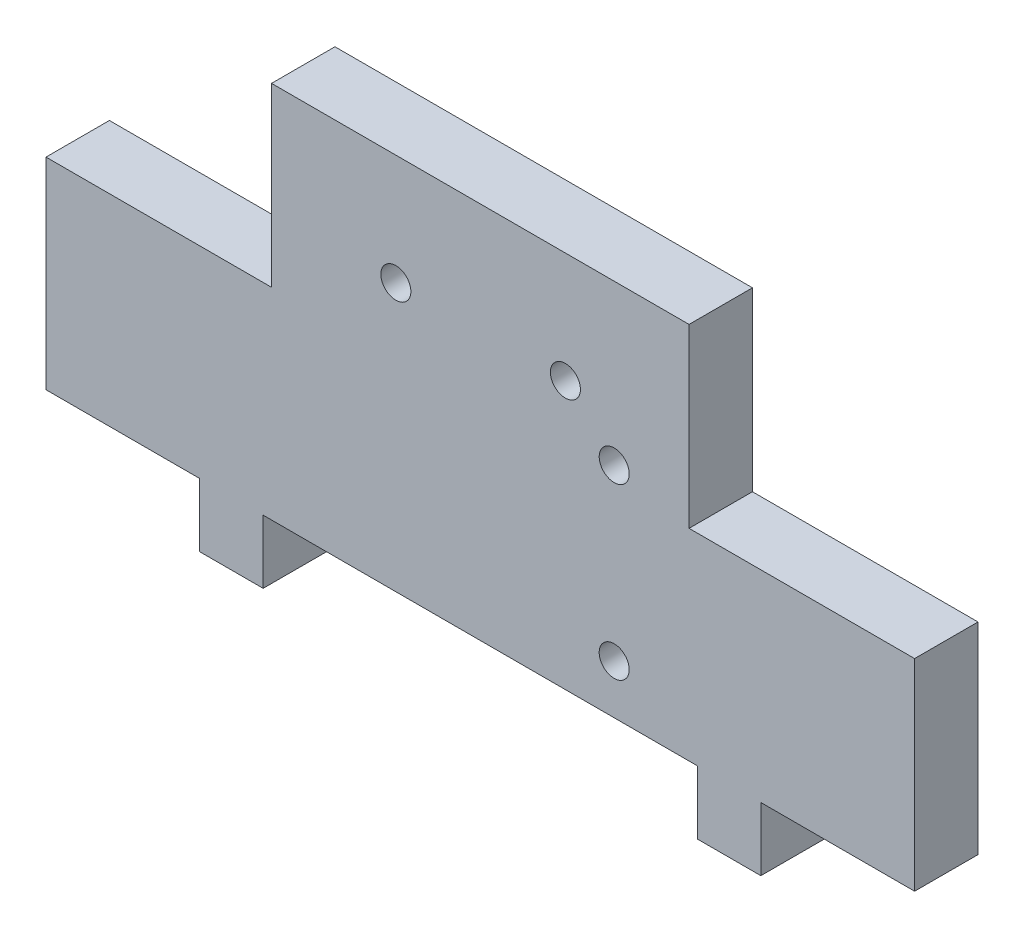
ISO-10303-21;
HEADER;
FILE_DESCRIPTION(('STEP AP214'),'2;1');
FILE_NAME('part.step','',(''),(''),'','','');
FILE_SCHEMA(('AUTOMOTIVE_DESIGN { 1 0 10303 214 1 1 1 1 }'));
ENDSEC;
DATA;
#1=APPLICATION_CONTEXT('core data for automotive mechanical design processes');
#2=APPLICATION_PROTOCOL_DEFINITION('international standard','automotive_design',2000,#1);
#3=PRODUCT_CONTEXT('',#1,'mechanical');
#4=PRODUCT('Part','Part','',(#3));
#5=PRODUCT_RELATED_PRODUCT_CATEGORY('part','',(#4));
#6=PRODUCT_DEFINITION_FORMATION('','',#4);
#7=PRODUCT_DEFINITION_CONTEXT('part definition',#1,'design');
#8=PRODUCT_DEFINITION('design','',#6,#7);
#9=PRODUCT_DEFINITION_SHAPE('','',#8);
#10=(LENGTH_UNIT() NAMED_UNIT(*) SI_UNIT(.MILLI.,.METRE.));
#11=(NAMED_UNIT(*) PLANE_ANGLE_UNIT() SI_UNIT($,.RADIAN.));
#12=(NAMED_UNIT(*) SI_UNIT($,.STERADIAN.) SOLID_ANGLE_UNIT());
#13=UNCERTAINTY_MEASURE_WITH_UNIT(LENGTH_MEASURE(1.E-05),#10,'distance_accuracy_value','');
#14=(GEOMETRIC_REPRESENTATION_CONTEXT(3) GLOBAL_UNCERTAINTY_ASSIGNED_CONTEXT((#13)) GLOBAL_UNIT_ASSIGNED_CONTEXT((#10,
#11,#12)) REPRESENTATION_CONTEXT('',''));
#15=CARTESIAN_POINT('',(0.,0.,0.));
#16=DIRECTION('',(0.,0.,1.));
#17=DIRECTION('',(1.,0.,0.));
#18=AXIS2_PLACEMENT_3D('',#15,#16,#17);
#19=CARTESIAN_POINT('',(0.,-9.525,4.5593));
#20=DIRECTION('',(0.,1.,0.));
#21=DIRECTION('',(-1.,0.,0.));
#22=AXIS2_PLACEMENT_3D('',#19,#20,#21);
#23=PLANE('',#22);
#24=DIRECTION('',(1.,0.,0.));
#25=VECTOR('',#24,1.);
#26=CARTESIAN_POINT('',(0.,-9.525,0.));
#27=LINE('',#26,#25);
#28=CARTESIAN_POINT('',(-20.173949999999,-9.52499999999995,-6.41847686111419E-13));
#29=VERTEX_POINT('',#28);
#30=CARTESIAN_POINT('',(-15.614649999999,-9.52499999999995,-5.95010152260045E-13));
#31=VERTEX_POINT('',#30);
#32=EDGE_CURVE('E229',#29,#31,#27,.T.);
#33=ORIENTED_EDGE('',*,*,#32,.T.);
#34=DIRECTION('',(0.,0.,-1.));
#35=VECTOR('',#34,1.);
#36=CARTESIAN_POINT('',(-15.6146499999992,-9.52499999999995,14.0893799999996));
#37=LINE('',#36,#35);
#38=CARTESIAN_POINT('',(-15.6146499999991,-9.52499999999995,4.5592999999994));
#39=VERTEX_POINT('',#38);
#40=EDGE_CURVE('E266',#39,#31,#37,.T.);
#41=ORIENTED_EDGE('',*,*,#40,.F.);
#42=DIRECTION('',(1.,0.,0.));
#43=VECTOR('',#42,1.);
#44=CARTESIAN_POINT('',(0.,-9.525,4.5593));
#45=LINE('',#44,#43);
#46=CARTESIAN_POINT('',(-20.1739499999991,-9.52499999999995,4.55929999999936));
#47=VERTEX_POINT('',#46);
#48=EDGE_CURVE('E207',#47,#39,#45,.T.);
#49=ORIENTED_EDGE('',*,*,#48,.F.);
#50=DIRECTION('',(0.,0.,-1.));
#51=VECTOR('',#50,1.);
#52=CARTESIAN_POINT('',(-20.1739499999992,-9.52499999999995,14.0893799999996));
#53=LINE('',#52,#51);
#54=EDGE_CURVE('E170',#47,#29,#53,.T.);
#55=ORIENTED_EDGE('',*,*,#54,.T.);
#56=EDGE_LOOP('',(#33,#41,#49,#55));
#57=FACE_BOUND('',#56,.T.);
#58=ADVANCED_FACE('F35',(#57),#23,.F.);
#59=CARTESIAN_POINT('',(15.614650000001,-9.52499999999995,-2.51534904016637E-13));
#60=VERTEX_POINT('',#59);
#61=CARTESIAN_POINT('',(20.173950000001,-9.52499999999999,0.));
#62=VERTEX_POINT('',#61);
#63=EDGE_CURVE('E226',#60,#62,#27,.T.);
#64=ORIENTED_EDGE('',*,*,#63,.T.);
#65=DIRECTION('',(0.,0.,-1.));
#66=VECTOR('',#65,1.);
#67=CARTESIAN_POINT('',(20.1739500000008,-9.52499999999995,14.08938));
#68=LINE('',#67,#66);
#69=CARTESIAN_POINT('',(20.1739500000009,-9.52499999999995,4.5592999999998));
#70=VERTEX_POINT('',#69);
#71=EDGE_CURVE('E260',#70,#62,#68,.T.);
#72=ORIENTED_EDGE('',*,*,#71,.F.);
#73=CARTESIAN_POINT('',(15.6146500000009,-9.52499999999995,4.55929999999975));
#74=VERTEX_POINT('',#73);
#75=EDGE_CURVE('E176',#74,#70,#45,.T.);
#76=ORIENTED_EDGE('',*,*,#75,.F.);
#77=DIRECTION('',(0.,0.,-1.));
#78=VECTOR('',#77,1.);
#79=CARTESIAN_POINT('',(15.6146500000008,-9.52499999999995,14.08938));
#80=LINE('',#79,#78);
#81=EDGE_CURVE('E263',#74,#60,#80,.T.);
#82=ORIENTED_EDGE('',*,*,#81,.T.);
#83=EDGE_LOOP('',(#64,#72,#76,#82));
#84=FACE_BOUND('',#83,.T.);
#85=ADVANCED_FACE('F284',(#84),#23,.F.);
#86=CARTESIAN_POINT('',(15.0109201230228,0.,4.5593));
#87=DIRECTION('',(-1.,0.,0.));
#88=DIRECTION('',(0.,-1.,0.));
#89=AXIS2_PLACEMENT_3D('',#86,#87,#88);
#90=PLANE('',#89);
#91=DIRECTION('',(0.,1.,0.));
#92=VECTOR('',#91,1.);
#93=CARTESIAN_POINT('',(15.0109201230228,0.,0.));
#94=LINE('',#93,#92);
#95=CARTESIAN_POINT('',(15.0109201230228,9.525,0.));
#96=VERTEX_POINT('',#95);
#97=CARTESIAN_POINT('',(15.0109201230228,22.225,0.));
#98=VERTEX_POINT('',#97);
#99=EDGE_CURVE('E160',#96,#98,#94,.T.);
#100=ORIENTED_EDGE('',*,*,#99,.T.);
#101=DIRECTION('',(0.,0.,-1.));
#102=VECTOR('',#101,1.);
#103=CARTESIAN_POINT('',(15.0109201230228,22.225,4.5593));
#104=LINE('',#103,#102);
#105=CARTESIAN_POINT('',(15.0109201230228,22.225,4.5593));
#106=VERTEX_POINT('',#105);
#107=EDGE_CURVE('E245',#106,#98,#104,.T.);
#108=ORIENTED_EDGE('',*,*,#107,.F.);
#109=DIRECTION('',(0.,1.,0.));
#110=VECTOR('',#109,1.);
#111=CARTESIAN_POINT('',(15.0109201230228,0.,4.5593));
#112=LINE('',#111,#110);
#113=CARTESIAN_POINT('',(15.0109201230228,9.525,4.5593));
#114=VERTEX_POINT('',#113);
#115=EDGE_CURVE('E192',#114,#106,#112,.T.);
#116=ORIENTED_EDGE('',*,*,#115,.F.);
#117=DIRECTION('',(0.,0.,-1.));
#118=VECTOR('',#117,1.);
#119=CARTESIAN_POINT('',(15.0109201230228,9.525,4.5593));
#120=LINE('',#119,#118);
#121=EDGE_CURVE('E212',#114,#96,#120,.T.);
#122=ORIENTED_EDGE('',*,*,#121,.T.);
#123=EDGE_LOOP('',(#100,#108,#116,#122));
#124=FACE_BOUND('',#123,.T.);
#125=ADVANCED_FACE('F37',(#124),#90,.F.);
#126=CARTESIAN_POINT('',(0.,22.225,4.5593));
#127=DIRECTION('',(0.,-1.,0.));
#128=DIRECTION('',(1.,0.,0.));
#129=AXIS2_PLACEMENT_3D('',#126,#127,#128);
#130=PLANE('',#129);
#131=DIRECTION('',(-1.,0.,0.));
#132=VECTOR('',#131,1.);
#133=CARTESIAN_POINT('',(0.,22.225,0.));
#134=LINE('',#133,#132);
#135=CARTESIAN_POINT('',(-15.0109201230229,22.225,0.));
#136=VERTEX_POINT('',#135);
#137=EDGE_CURVE('E215',#98,#136,#134,.T.);
#138=ORIENTED_EDGE('',*,*,#137,.T.);
#139=DIRECTION('',(0.,0.,-1.));
#140=VECTOR('',#139,1.);
#141=CARTESIAN_POINT('',(-15.0109201230229,22.225,4.5593));
#142=LINE('',#141,#140);
#143=CARTESIAN_POINT('',(-15.0109201230229,22.225,4.5593));
#144=VERTEX_POINT('',#143);
#145=EDGE_CURVE('E243',#144,#136,#142,.T.);
#146=ORIENTED_EDGE('',*,*,#145,.F.);
#147=DIRECTION('',(-1.,0.,0.));
#148=VECTOR('',#147,1.);
#149=CARTESIAN_POINT('',(0.,22.225,4.5593));
#150=LINE('',#149,#148);
#151=EDGE_CURVE('E195',#106,#144,#150,.T.);
#152=ORIENTED_EDGE('',*,*,#151,.F.);
#153=ORIENTED_EDGE('',*,*,#107,.T.);
#154=EDGE_LOOP('',(#138,#146,#152,#153));
#155=FACE_BOUND('',#154,.T.);
#156=ADVANCED_FACE('F300',(#155),#130,.F.);
#157=CARTESIAN_POINT('',(-15.0109201230229,0.,4.5593));
#158=DIRECTION('',(-1.,0.,0.));
#159=DIRECTION('',(0.,0.,1.));
#160=AXIS2_PLACEMENT_3D('',#157,#158,#159);
#161=PLANE('',#160);
#162=DIRECTION('',(0.,1.,0.));
#163=VECTOR('',#162,1.);
#164=CARTESIAN_POINT('',(-15.0109201230229,0.,0.));
#165=LINE('',#164,#163);
#166=CARTESIAN_POINT('',(-15.0109201230229,9.52500000000001,0.));
#167=VERTEX_POINT('',#166);
#168=EDGE_CURVE('E218',#167,#136,#165,.T.);
#169=ORIENTED_EDGE('',*,*,#168,.F.);
#170=DIRECTION('',(0.,0.,-1.));
#171=VECTOR('',#170,1.);
#172=CARTESIAN_POINT('',(-15.0109201230229,9.52500000000001,4.5593));
#173=LINE('',#172,#171);
#174=CARTESIAN_POINT('',(-15.0109201230229,9.52500000000001,4.5593));
#175=VERTEX_POINT('',#174);
#176=EDGE_CURVE('E241',#175,#167,#173,.T.);
#177=ORIENTED_EDGE('',*,*,#176,.F.);
#178=DIRECTION('',(0.,1.,0.));
#179=VECTOR('',#178,1.);
#180=CARTESIAN_POINT('',(-15.0109201230229,0.,4.5593));
#181=LINE('',#180,#179);
#182=EDGE_CURVE('E198',#175,#144,#181,.T.);
#183=ORIENTED_EDGE('',*,*,#182,.T.);
#184=ORIENTED_EDGE('',*,*,#145,.T.);
#185=EDGE_LOOP('',(#169,#177,#183,#184));
#186=FACE_BOUND('',#185,.T.);
#187=ADVANCED_FACE('F385',(#186),#161,.T.);
#188=CARTESIAN_POINT('',(0.,9.52500000000001,4.5593));
#189=DIRECTION('',(0.,1.,0.));
#190=DIRECTION('',(0.,0.,1.));
#191=AXIS2_PLACEMENT_3D('',#188,#189,#190);
#192=PLANE('',#191);
#193=DIRECTION('',(1.,0.,0.));
#194=VECTOR('',#193,1.);
#195=CARTESIAN_POINT('',(0.,9.52500000000001,0.));
#196=LINE('',#195,#194);
#197=CARTESIAN_POINT('',(-31.2293,9.52500000000001,0.));
#198=VERTEX_POINT('',#197);
#199=EDGE_CURVE('E221',#198,#167,#196,.T.);
#200=ORIENTED_EDGE('',*,*,#199,.F.);
#201=DIRECTION('',(0.,0.,-1.));
#202=VECTOR('',#201,1.);
#203=CARTESIAN_POINT('',(-31.2293,9.52500000000001,4.5593));
#204=LINE('',#203,#202);
#205=CARTESIAN_POINT('',(-31.2293,9.52500000000001,4.5593));
#206=VERTEX_POINT('',#205);
#207=EDGE_CURVE('E238',#206,#198,#204,.T.);
#208=ORIENTED_EDGE('',*,*,#207,.F.);
#209=DIRECTION('',(1.,0.,0.));
#210=VECTOR('',#209,1.);
#211=CARTESIAN_POINT('',(0.,9.52500000000001,4.5593));
#212=LINE('',#211,#210);
#213=EDGE_CURVE('E201',#206,#175,#212,.T.);
#214=ORIENTED_EDGE('',*,*,#213,.T.);
#215=ORIENTED_EDGE('',*,*,#176,.T.);
#216=EDGE_LOOP('',(#200,#208,#214,#215));
#217=FACE_BOUND('',#216,.T.);
#218=ADVANCED_FACE('F309',(#217),#192,.T.);
#219=CARTESIAN_POINT('',(-31.2293,0.,4.5593));
#220=DIRECTION('',(-1.,0.,0.));
#221=DIRECTION('',(0.,0.,1.));
#222=AXIS2_PLACEMENT_3D('',#219,#220,#221);
#223=PLANE('',#222);
#224=DIRECTION('',(0.,0.,1.));
#225=VECTOR('',#224,1.);
#226=CARTESIAN_POINT('',(-31.2293,-4.96570000000002,14.08938));
#227=LINE('',#226,#225);
#228=CARTESIAN_POINT('',(-31.2293,-4.96570000000002,0.));
#229=VERTEX_POINT('',#228);
#230=CARTESIAN_POINT('',(-31.2293,-4.96570000000002,4.5593));
#231=VERTEX_POINT('',#230);
#232=EDGE_CURVE('E187',#229,#231,#227,.T.);
#233=ORIENTED_EDGE('',*,*,#232,.T.);
#234=DIRECTION('',(0.,1.,0.));
#235=VECTOR('',#234,1.);
#236=CARTESIAN_POINT('',(-31.2293,0.,4.5593));
#237=LINE('',#236,#235);
#238=EDGE_CURVE('E204',#231,#206,#237,.T.);
#239=ORIENTED_EDGE('',*,*,#238,.T.);
#240=ORIENTED_EDGE('',*,*,#207,.T.);
#241=DIRECTION('',(0.,1.,0.));
#242=VECTOR('',#241,1.);
#243=CARTESIAN_POINT('',(-31.2293,0.,0.));
#244=LINE('',#243,#242);
#245=EDGE_CURVE('E224',#229,#198,#244,.T.);
#246=ORIENTED_EDGE('',*,*,#245,.F.);
#247=EDGE_LOOP('',(#233,#239,#240,#246));
#248=FACE_BOUND('',#247,.T.);
#249=ADVANCED_FACE('F313',(#248),#223,.T.);
#250=CARTESIAN_POINT('',(31.2293,0.,4.5593));
#251=DIRECTION('',(-1.,0.,0.));
#252=DIRECTION('',(0.,-1.,0.));
#253=AXIS2_PLACEMENT_3D('',#250,#251,#252);
#254=PLANE('',#253);
#255=DIRECTION('',(0.,1.,0.));
#256=VECTOR('',#255,1.);
#257=CARTESIAN_POINT('',(31.2293,0.,4.5593));
#258=LINE('',#257,#256);
#259=CARTESIAN_POINT('',(31.2293000000009,-4.96570000000003,4.5593));
#260=VERTEX_POINT('',#259);
#261=CARTESIAN_POINT('',(31.2293,9.52500000000001,4.5593));
#262=VERTEX_POINT('',#261);
#263=EDGE_CURVE('E208',#260,#262,#258,.T.);
#264=ORIENTED_EDGE('',*,*,#263,.F.);
#265=DIRECTION('',(0.,0.,-1.));
#266=VECTOR('',#265,1.);
#267=CARTESIAN_POINT('',(31.2293000000008,-4.96570000000003,14.0893799999999));
#268=LINE('',#267,#266);
#269=CARTESIAN_POINT('',(31.229300000001,-4.96570000000003,0.));
#270=VERTEX_POINT('',#269);
#271=EDGE_CURVE('E156',#260,#270,#268,.T.);
#272=ORIENTED_EDGE('',*,*,#271,.T.);
#273=DIRECTION('',(0.,1.,0.));
#274=VECTOR('',#273,1.);
#275=CARTESIAN_POINT('',(31.2293,0.,0.));
#276=LINE('',#275,#274);
#277=CARTESIAN_POINT('',(31.2293,9.52500000000001,0.));
#278=VERTEX_POINT('',#277);
#279=EDGE_CURVE('E230',#270,#278,#276,.T.);
#280=ORIENTED_EDGE('',*,*,#279,.T.);
#281=DIRECTION('',(0.,0.,-1.));
#282=VECTOR('',#281,1.);
#283=CARTESIAN_POINT('',(31.2293,9.52500000000001,4.5593));
#284=LINE('',#283,#282);
#285=EDGE_CURVE('E235',#262,#278,#284,.T.);
#286=ORIENTED_EDGE('',*,*,#285,.F.);
#287=EDGE_LOOP('',(#264,#272,#280,#286));
#288=FACE_BOUND('',#287,.T.);
#289=ADVANCED_FACE('F289',(#288),#254,.F.);
#290=CARTESIAN_POINT('',(0.,9.52499999999999,4.5593));
#291=DIRECTION('',(0.,-1.,0.));
#292=DIRECTION('',(1.,0.,0.));
#293=AXIS2_PLACEMENT_3D('',#290,#291,#292);
#294=PLANE('',#293);
#295=DIRECTION('',(-1.,0.,0.));
#296=VECTOR('',#295,1.);
#297=CARTESIAN_POINT('',(0.,9.52499999999999,0.));
#298=LINE('',#297,#296);
#299=EDGE_CURVE('E196',#278,#96,#298,.T.);
#300=ORIENTED_EDGE('',*,*,#299,.T.);
#301=ORIENTED_EDGE('',*,*,#121,.F.);
#302=DIRECTION('',(-1.,0.,0.));
#303=VECTOR('',#302,1.);
#304=CARTESIAN_POINT('',(0.,9.52499999999999,4.5593));
#305=LINE('',#304,#303);
#306=EDGE_CURVE('E210',#262,#114,#305,.T.);
#307=ORIENTED_EDGE('',*,*,#306,.F.);
#308=ORIENTED_EDGE('',*,*,#285,.T.);
#309=EDGE_LOOP('',(#300,#301,#307,#308));
#310=FACE_BOUND('',#309,.T.);
#311=ADVANCED_FACE('F296',(#310),#294,.F.);
#312=CARTESIAN_POINT('',(0.,0.,4.5593));
#313=DIRECTION('',(0.,0.,1.));
#314=DIRECTION('',(1.,0.,0.));
#315=AXIS2_PLACEMENT_3D('',#312,#313,#314);
#316=PLANE('',#315);
#317=CARTESIAN_POINT('',(-6.07199999999966,14.2683799999989,4.55930000000009));
#318=DIRECTION('',(0.,0.,1.));
#319=DIRECTION('',(-0.381849318688142,-0.924224592735663,0.));
#320=AXIS2_PLACEMENT_3D('',#317,#318,#319);
#321=CIRCLE('',#320,1.0795);
#322=CARTESIAN_POINT('',(-6.48420633952351,13.2706795521408,4.55930000000009));
#323=VERTEX_POINT('',#322);
#324=EDGE_CURVE('E340',#323,#323,#321,.T.);
#325=ORIENTED_EDGE('',*,*,#324,.F.);
#326=EDGE_LOOP('',(#325));
#327=FACE_BOUND('',#326,.T.);
#328=CARTESIAN_POINT('',(6.12000000000034,14.2683799999988,4.5593000000001));
#329=DIRECTION('',(0.,0.,1.));
#330=DIRECTION('',(-0.381849318688143,-0.924224592735662,0.));
#331=AXIS2_PLACEMENT_3D('',#328,#329,#330);
#332=CIRCLE('',#331,1.0795);
#333=CARTESIAN_POINT('',(5.70779366047649,13.2706795521407,4.5593000000001));
#334=VERTEX_POINT('',#333);
#335=EDGE_CURVE('E343',#334,#334,#332,.T.);
#336=ORIENTED_EDGE('',*,*,#335,.F.);
#337=EDGE_LOOP('',(#336));
#338=FACE_BOUND('',#337,.T.);
#339=CARTESIAN_POINT('',(9.62799999999952,-1.43162000000138,4.55930000000003));
#340=DIRECTION('',(0.,0.,1.));
#341=DIRECTION('',(0.381849318686875,0.924224592736186,0.));
#342=AXIS2_PLACEMENT_3D('',#339,#340,#341);
#343=CIRCLE('',#342,1.0795);
#344=CARTESIAN_POINT('',(10.040206339522,-0.433919552142667,4.55930000000003));
#345=VERTEX_POINT('',#344);
#346=EDGE_CURVE('E339',#345,#345,#343,.T.);
#347=ORIENTED_EDGE('',*,*,#346,.F.);
#348=EDGE_LOOP('',(#347));
#349=FACE_BOUND('',#348,.T.);
#350=CARTESIAN_POINT('',(9.62800000000033,10.7603799999988,4.55930000000007));
#351=DIRECTION('',(0.,0.,1.));
#352=DIRECTION('',(-0.381849318688229,-0.924224592735627,0.));
#353=AXIS2_PLACEMENT_3D('',#350,#351,#352);
#354=CIRCLE('',#353,1.0795);
#355=CARTESIAN_POINT('',(10.0402063395243,11.7580804478569,4.55930000000007));
#356=VERTEX_POINT('',#355);
#357=EDGE_CURVE('E253',#356,#356,#354,.T.);
#358=ORIENTED_EDGE('',*,*,#357,.F.);
#359=EDGE_LOOP('',(#358));
#360=FACE_BOUND('',#359,.T.);
#361=DIRECTION('',(-1.,0.,0.));
#362=VECTOR('',#361,1.);
#363=CARTESIAN_POINT('',(0.,-4.96570000000003,4.5593));
#364=LINE('',#363,#362);
#365=CARTESIAN_POINT('',(20.1739500000009,-4.96569999999995,4.5592999999998));
#366=VERTEX_POINT('',#365);
#367=EDGE_CURVE('E151',#260,#366,#364,.T.);
#368=ORIENTED_EDGE('',*,*,#367,.F.);
#369=ORIENTED_EDGE('',*,*,#263,.T.);
#370=ORIENTED_EDGE('',*,*,#306,.T.);
#371=ORIENTED_EDGE('',*,*,#115,.T.);
#372=ORIENTED_EDGE('',*,*,#151,.T.);
#373=ORIENTED_EDGE('',*,*,#182,.F.);
#374=ORIENTED_EDGE('',*,*,#213,.F.);
#375=ORIENTED_EDGE('',*,*,#238,.F.);
#376=CARTESIAN_POINT('',(-20.1739499999991,-4.96569999999995,4.55929999999936));
#377=VERTEX_POINT('',#376);
#378=EDGE_CURVE('E163',#377,#231,#364,.T.);
#379=ORIENTED_EDGE('',*,*,#378,.F.);
#380=DIRECTION('',(0.,-1.,0.));
#381=VECTOR('',#380,1.);
#382=CARTESIAN_POINT('',(-20.1739499999991,-4.96569999999995,4.55929999999936));
#383=LINE('',#382,#381);
#384=EDGE_CURVE('E275',#377,#47,#383,.T.);
#385=ORIENTED_EDGE('',*,*,#384,.T.);
#386=ORIENTED_EDGE('',*,*,#48,.T.);
#387=DIRECTION('',(0.,-1.,0.));
#388=VECTOR('',#387,1.);
#389=CARTESIAN_POINT('',(-15.6146499999991,-4.96569999999995,4.5592999999994));
#390=LINE('',#389,#388);
#391=CARTESIAN_POINT('',(-15.6146499999991,-4.96569999999995,4.5592999999994));
#392=VERTEX_POINT('',#391);
#393=EDGE_CURVE('E190',#392,#39,#390,.T.);
#394=ORIENTED_EDGE('',*,*,#393,.F.);
#395=CARTESIAN_POINT('',(15.6146500000009,-4.96569999999995,4.55929999999975));
#396=VERTEX_POINT('',#395);
#397=EDGE_CURVE('E161',#396,#392,#364,.T.);
#398=ORIENTED_EDGE('',*,*,#397,.F.);
#399=DIRECTION('',(0.,-1.,0.));
#400=VECTOR('',#399,1.);
#401=CARTESIAN_POINT('',(15.6146500000009,-4.96569999999995,4.55929999999975));
#402=LINE('',#401,#400);
#403=EDGE_CURVE('E178',#396,#74,#402,.T.);
#404=ORIENTED_EDGE('',*,*,#403,.T.);
#405=ORIENTED_EDGE('',*,*,#75,.T.);
#406=DIRECTION('',(0.,-1.,0.));
#407=VECTOR('',#406,1.);
#408=CARTESIAN_POINT('',(20.1739500000009,-4.96569999999995,4.5592999999998));
#409=LINE('',#408,#407);
#410=EDGE_CURVE('E166',#366,#70,#409,.T.);
#411=ORIENTED_EDGE('',*,*,#410,.F.);
#412=EDGE_LOOP('',(#368,#369,#370,#371,#372,#373,#374,#375,#379,#385,#386,#394,#398,#404,#405,#411));
#413=FACE_BOUND('',#412,.T.);
#414=ADVANCED_FACE('F173',(#327,#338,#349,#360,#413),#316,.T.);
#415=CARTESIAN_POINT('',(0.,0.,0.));
#416=DIRECTION('',(0.,0.,1.));
#417=DIRECTION('',(1.,0.,0.));
#418=AXIS2_PLACEMENT_3D('',#415,#416,#417);
#419=PLANE('',#418);
#420=CARTESIAN_POINT('',(-6.07199999999966,14.2683799999989,0.));
#421=DIRECTION('',(0.,0.,1.));
#422=DIRECTION('',(1.,0.,0.));
#423=AXIS2_PLACEMENT_3D('',#420,#421,#422);
#424=CIRCLE('',#423,1.0795);
#425=CARTESIAN_POINT('',(-4.99249999999966,14.2683799999989,0.));
#426=VERTEX_POINT('',#425);
#427=EDGE_CURVE('E39',#426,#426,#424,.F.);
#428=ORIENTED_EDGE('',*,*,#427,.F.);
#429=EDGE_LOOP('',(#428));
#430=FACE_BOUND('',#429,.T.);
#431=CARTESIAN_POINT('',(6.12000000000034,14.2683799999988,0.));
#432=DIRECTION('',(0.,0.,1.));
#433=DIRECTION('',(1.,0.,0.));
#434=AXIS2_PLACEMENT_3D('',#431,#432,#433);
#435=CIRCLE('',#434,1.0795);
#436=CARTESIAN_POINT('',(7.19950000000034,14.2683799999988,0.));
#437=VERTEX_POINT('',#436);
#438=EDGE_CURVE('E255',#437,#437,#435,.F.);
#439=ORIENTED_EDGE('',*,*,#438,.F.);
#440=EDGE_LOOP('',(#439));
#441=FACE_BOUND('',#440,.T.);
#442=CARTESIAN_POINT('',(9.62799999999952,-1.43162000000138,0.));
#443=DIRECTION('',(0.,0.,1.));
#444=DIRECTION('',(1.,0.,0.));
#445=AXIS2_PLACEMENT_3D('',#442,#443,#444);
#446=CIRCLE('',#445,1.0795);
#447=CARTESIAN_POINT('',(10.7074999999995,-1.43162000000138,0.));
#448=VERTEX_POINT('',#447);
#449=EDGE_CURVE('E252',#448,#448,#446,.F.);
#450=ORIENTED_EDGE('',*,*,#449,.F.);
#451=EDGE_LOOP('',(#450));
#452=FACE_BOUND('',#451,.T.);
#453=CARTESIAN_POINT('',(9.62800000000033,10.7603799999988,0.));
#454=DIRECTION('',(0.,0.,1.));
#455=DIRECTION('',(1.,0.,0.));
#456=AXIS2_PLACEMENT_3D('',#453,#454,#455);
#457=CIRCLE('',#456,1.0795);
#458=CARTESIAN_POINT('',(10.0402063395243,11.7580804478569,0.));
#459=VERTEX_POINT('',#458);
#460=EDGE_CURVE('E249',#459,#459,#457,.F.);
#461=ORIENTED_EDGE('',*,*,#460,.F.);
#462=EDGE_LOOP('',(#461));
#463=FACE_BOUND('',#462,.T.);
#464=ORIENTED_EDGE('',*,*,#279,.F.);
#465=DIRECTION('',(-1.,0.,0.));
#466=VECTOR('',#465,1.);
#467=CARTESIAN_POINT('',(0.,-4.96570000000003,0.));
#468=LINE('',#467,#466);
#469=CARTESIAN_POINT('',(20.173950000001,-4.96569999999995,-1.99493199737333E-13));
#470=VERTEX_POINT('',#469);
#471=EDGE_CURVE('E11',#270,#470,#468,.T.);
#472=ORIENTED_EDGE('',*,*,#471,.T.);
#473=DIRECTION('',(0.,-1.,0.));
#474=VECTOR('',#473,1.);
#475=CARTESIAN_POINT('',(20.173950000001,-4.96569999999995,-1.99493199737333E-13));
#476=LINE('',#475,#474);
#477=EDGE_CURVE('E169',#470,#62,#476,.T.);
#478=ORIENTED_EDGE('',*,*,#477,.T.);
#479=ORIENTED_EDGE('',*,*,#63,.F.);
#480=DIRECTION('',(0.,-1.,0.));
#481=VECTOR('',#480,1.);
#482=CARTESIAN_POINT('',(15.614650000001,-4.96569999999995,-2.51534904016637E-13));
#483=LINE('',#482,#481);
#484=CARTESIAN_POINT('',(15.614650000001,-4.96569999999995,0.));
#485=VERTEX_POINT('',#484);
#486=EDGE_CURVE('E183',#485,#60,#483,.T.);
#487=ORIENTED_EDGE('',*,*,#486,.F.);
#488=CARTESIAN_POINT('',(-15.614649999999,-4.96569999999995,-5.95010152260045E-13));
#489=VERTEX_POINT('',#488);
#490=EDGE_CURVE('E46',#485,#489,#468,.T.);
#491=ORIENTED_EDGE('',*,*,#490,.T.);
#492=DIRECTION('',(0.,-1.,0.));
#493=VECTOR('',#492,1.);
#494=CARTESIAN_POINT('',(-15.614649999999,-4.96569999999995,-5.95010152260045E-13));
#495=LINE('',#494,#493);
#496=EDGE_CURVE('E177',#489,#31,#495,.T.);
#497=ORIENTED_EDGE('',*,*,#496,.T.);
#498=ORIENTED_EDGE('',*,*,#32,.F.);
#499=DIRECTION('',(0.,-1.,0.));
#500=VECTOR('',#499,1.);
#501=CARTESIAN_POINT('',(-20.173949999999,-4.96569999999995,-6.41847686111419E-13));
#502=LINE('',#501,#500);
#503=CARTESIAN_POINT('',(-20.173949999999,-4.96569999999995,0.));
#504=VERTEX_POINT('',#503);
#505=EDGE_CURVE('E181',#504,#29,#502,.T.);
#506=ORIENTED_EDGE('',*,*,#505,.F.);
#507=EDGE_CURVE('E44',#504,#229,#468,.T.);
#508=ORIENTED_EDGE('',*,*,#507,.T.);
#509=ORIENTED_EDGE('',*,*,#245,.T.);
#510=ORIENTED_EDGE('',*,*,#199,.T.);
#511=ORIENTED_EDGE('',*,*,#168,.T.);
#512=ORIENTED_EDGE('',*,*,#137,.F.);
#513=ORIENTED_EDGE('',*,*,#99,.F.);
#514=ORIENTED_EDGE('',*,*,#299,.F.);
#515=EDGE_LOOP('',(#464,#472,#478,#479,#487,#491,#497,#498,#506,#508,#509,#510,#511,#512,#513,#514));
#516=FACE_BOUND('',#515,.T.);
#517=ADVANCED_FACE('F286',(#430,#441,#452,#463,#516),#419,.F.);
#518=CARTESIAN_POINT('',(-15.6146499999992,-4.96569999999995,14.0893799999996));
#519=DIRECTION('',(-1.,0.,0.));
#520=DIRECTION('',(0.,0.,1.));
#521=AXIS2_PLACEMENT_3D('',#518,#519,#520);
#522=PLANE('',#521);
#523=ORIENTED_EDGE('',*,*,#40,.T.);
#524=ORIENTED_EDGE('',*,*,#496,.F.);
#525=DIRECTION('',(0.,0.,-1.));
#526=VECTOR('',#525,1.);
#527=CARTESIAN_POINT('',(-15.6146499999992,-4.96569999999995,14.0893799999996));
#528=LINE('',#527,#526);
#529=EDGE_CURVE('E321',#392,#489,#528,.T.);
#530=ORIENTED_EDGE('',*,*,#529,.F.);
#531=ORIENTED_EDGE('',*,*,#393,.T.);
#532=EDGE_LOOP('',(#523,#524,#530,#531));
#533=FACE_BOUND('',#532,.T.);
#534=ADVANCED_FACE('F330',(#533),#522,.F.);
#535=CARTESIAN_POINT('',(15.6146500000008,-4.96569999999995,14.08938));
#536=DIRECTION('',(-1.,0.,0.));
#537=DIRECTION('',(0.,0.,1.));
#538=AXIS2_PLACEMENT_3D('',#535,#536,#537);
#539=PLANE('',#538);
#540=ORIENTED_EDGE('',*,*,#81,.F.);
#541=ORIENTED_EDGE('',*,*,#403,.F.);
#542=DIRECTION('',(0.,0.,-1.));
#543=VECTOR('',#542,1.);
#544=CARTESIAN_POINT('',(15.6146500000008,-4.96569999999995,14.08938));
#545=LINE('',#544,#543);
#546=EDGE_CURVE('E61',#396,#485,#545,.T.);
#547=ORIENTED_EDGE('',*,*,#546,.T.);
#548=ORIENTED_EDGE('',*,*,#486,.T.);
#549=EDGE_LOOP('',(#540,#541,#547,#548));
#550=FACE_BOUND('',#549,.T.);
#551=ADVANCED_FACE('F280',(#550),#539,.T.);
#552=CARTESIAN_POINT('',(31.2293000000008,-4.96570000000003,14.0893799999999));
#553=DIRECTION('',(0.,1.,0.));
#554=DIRECTION('',(0.,0.,1.));
#555=AXIS2_PLACEMENT_3D('',#552,#553,#554);
#556=PLANE('',#555);
#557=ORIENTED_EDGE('',*,*,#397,.T.);
#558=ORIENTED_EDGE('',*,*,#529,.T.);
#559=ORIENTED_EDGE('',*,*,#490,.F.);
#560=ORIENTED_EDGE('',*,*,#546,.F.);
#561=EDGE_LOOP('',(#557,#558,#559,#560));
#562=FACE_BOUND('',#561,.T.);
#563=ADVANCED_FACE('F333',(#562),#556,.F.);
#564=CARTESIAN_POINT('',(20.1739500000008,-4.96569999999995,14.08938));
#565=DIRECTION('',(-1.,0.,0.));
#566=DIRECTION('',(0.,0.,1.));
#567=AXIS2_PLACEMENT_3D('',#564,#565,#566);
#568=PLANE('',#567);
#569=ORIENTED_EDGE('',*,*,#71,.T.);
#570=ORIENTED_EDGE('',*,*,#477,.F.);
#571=DIRECTION('',(0.,0.,-1.));
#572=VECTOR('',#571,1.);
#573=CARTESIAN_POINT('',(20.1739500000008,-4.96569999999995,14.08938));
#574=LINE('',#573,#572);
#575=EDGE_CURVE('E154',#366,#470,#574,.T.);
#576=ORIENTED_EDGE('',*,*,#575,.F.);
#577=ORIENTED_EDGE('',*,*,#410,.T.);
#578=EDGE_LOOP('',(#569,#570,#576,#577));
#579=FACE_BOUND('',#578,.T.);
#580=ADVANCED_FACE('F165',(#579),#568,.F.);
#581=ORIENTED_EDGE('',*,*,#367,.T.);
#582=ORIENTED_EDGE('',*,*,#575,.T.);
#583=ORIENTED_EDGE('',*,*,#471,.F.);
#584=ORIENTED_EDGE('',*,*,#271,.F.);
#585=EDGE_LOOP('',(#581,#582,#583,#584));
#586=FACE_BOUND('',#585,.T.);
#587=ADVANCED_FACE('F153',(#586),#556,.F.);
#588=ORIENTED_EDGE('',*,*,#378,.T.);
#589=ORIENTED_EDGE('',*,*,#232,.F.);
#590=ORIENTED_EDGE('',*,*,#507,.F.);
#591=DIRECTION('',(0.,0.,-1.));
#592=VECTOR('',#591,1.);
#593=CARTESIAN_POINT('',(-20.1739499999992,-4.96569999999995,14.0893799999996));
#594=LINE('',#593,#592);
#595=EDGE_CURVE('E53',#377,#504,#594,.T.);
#596=ORIENTED_EDGE('',*,*,#595,.F.);
#597=EDGE_LOOP('',(#588,#589,#590,#596));
#598=FACE_BOUND('',#597,.T.);
#599=ADVANCED_FACE('F318',(#598),#556,.F.);
#600=CARTESIAN_POINT('',(-20.1739499999992,-4.96569999999995,14.0893799999996));
#601=DIRECTION('',(-1.,0.,0.));
#602=DIRECTION('',(0.,0.,1.));
#603=AXIS2_PLACEMENT_3D('',#600,#601,#602);
#604=PLANE('',#603);
#605=ORIENTED_EDGE('',*,*,#54,.F.);
#606=ORIENTED_EDGE('',*,*,#384,.F.);
#607=ORIENTED_EDGE('',*,*,#595,.T.);
#608=ORIENTED_EDGE('',*,*,#505,.T.);
#609=EDGE_LOOP('',(#605,#606,#607,#608));
#610=FACE_BOUND('',#609,.T.);
#611=ADVANCED_FACE('F322',(#610),#604,.T.);
#612=CARTESIAN_POINT('',(9.62800000000033,10.7603799999988,4.55930000000007));
#613=DIRECTION('',(0.,0.,-1.));
#614=DIRECTION('',(0.381849318688229,0.924224592735627,0.));
#615=AXIS2_PLACEMENT_3D('',#612,#613,#614);
#616=CYLINDRICAL_SURFACE('',#615,1.0795);
#617=CARTESIAN_POINT('',(10.0402063395243,11.7580804478569,4.55930000000007));
#618=CARTESIAN_POINT('',(10.0402063395243,11.7580804478569,4.51180729166674));
#619=CARTESIAN_POINT('',(10.0402063395243,11.7580804478569,4.4643145833334));
#620=CARTESIAN_POINT('',(10.0402063395243,11.7580804478569,4.36932916666674));
#621=CARTESIAN_POINT('',(10.0402063395243,11.7580804478569,4.3218364583334));
#622=CARTESIAN_POINT('',(10.0402063395243,11.7580804478569,4.22685104166673));
#623=CARTESIAN_POINT('',(10.0402063395243,11.7580804478569,4.1793583333334));
#624=CARTESIAN_POINT('',(10.0402063395243,11.7580804478569,4.08437291666673));
#625=CARTESIAN_POINT('',(10.0402063395243,11.7580804478569,4.0368802083334));
#626=CARTESIAN_POINT('',(10.0402063395243,11.7580804478569,3.94189479166673));
#627=CARTESIAN_POINT('',(10.0402063395243,11.7580804478569,3.8944020833334));
#628=CARTESIAN_POINT('',(10.0402063395243,11.7580804478569,3.79941666666673));
#629=CARTESIAN_POINT('',(10.0402063395243,11.7580804478569,3.75192395833339));
#630=CARTESIAN_POINT('',(10.0402063395243,11.7580804478569,3.65693854166673));
#631=CARTESIAN_POINT('',(10.0402063395243,11.7580804478569,3.60944583333339));
#632=CARTESIAN_POINT('',(10.0402063395243,11.7580804478569,3.51446041666672));
#633=CARTESIAN_POINT('',(10.0402063395243,11.7580804478569,3.46696770833339));
#634=CARTESIAN_POINT('',(10.0402063395243,11.7580804478569,3.37198229166672));
#635=CARTESIAN_POINT('',(10.0402063395243,11.7580804478569,3.32448958333339));
#636=CARTESIAN_POINT('',(10.0402063395243,11.7580804478569,3.22950416666672));
#637=CARTESIAN_POINT('',(10.0402063395243,11.7580804478569,3.18201145833338));
#638=CARTESIAN_POINT('',(10.0402063395243,11.7580804478569,3.08702604166672));
#639=CARTESIAN_POINT('',(10.0402063395243,11.7580804478569,3.03953333333338));
#640=CARTESIAN_POINT('',(10.0402063395243,11.7580804478569,2.94454791666671));
#641=CARTESIAN_POINT('',(10.0402063395243,11.7580804478569,2.89705520833338));
#642=CARTESIAN_POINT('',(10.0402063395243,11.7580804478569,2.80206979166671));
#643=CARTESIAN_POINT('',(10.0402063395243,11.7580804478569,2.75457708333338));
#644=CARTESIAN_POINT('',(10.0402063395243,11.7580804478569,2.65959166666671));
#645=CARTESIAN_POINT('',(10.0402063395243,11.7580804478569,2.61209895833337));
#646=CARTESIAN_POINT('',(10.0402063395243,11.7580804478569,2.51711354166671));
#647=CARTESIAN_POINT('',(10.0402063395243,11.7580804478569,2.46962083333337));
#648=CARTESIAN_POINT('',(10.0402063395243,11.7580804478569,2.3746354166667));
#649=CARTESIAN_POINT('',(10.0402063395243,11.7580804478569,2.32714270833337));
#650=CARTESIAN_POINT('',(10.0402063395243,11.7580804478569,2.2321572916667));
#651=CARTESIAN_POINT('',(10.0402063395243,11.7580804478569,2.18466458333337));
#652=CARTESIAN_POINT('',(10.0402063395243,11.7580804478569,2.0896791666667));
#653=CARTESIAN_POINT('',(10.0402063395243,11.7580804478569,2.04218645833337));
#654=CARTESIAN_POINT('',(10.0402063395243,11.7580804478569,1.9472010416667));
#655=CARTESIAN_POINT('',(10.0402063395243,11.7580804478569,1.89970833333336));
#656=CARTESIAN_POINT('',(10.0402063395243,11.7580804478569,1.80472291666669));
#657=CARTESIAN_POINT('',(10.0402063395243,11.7580804478569,1.75723020833336));
#658=CARTESIAN_POINT('',(10.0402063395243,11.7580804478569,1.66224479166669));
#659=CARTESIAN_POINT('',(10.0402063395243,11.7580804478569,1.61475208333336));
#660=CARTESIAN_POINT('',(10.0402063395243,11.7580804478569,1.51976666666669));
#661=CARTESIAN_POINT('',(10.0402063395243,11.7580804478569,1.47227395833336));
#662=CARTESIAN_POINT('',(10.0402063395243,11.7580804478569,1.37728854166669));
#663=CARTESIAN_POINT('',(10.0402063395243,11.7580804478569,1.32979583333335));
#664=CARTESIAN_POINT('',(10.0402063395243,11.7580804478569,1.23481041666669));
#665=CARTESIAN_POINT('',(10.0402063395243,11.7580804478569,1.18731770833335));
#666=CARTESIAN_POINT('',(10.0402063395243,11.7580804478569,1.09233229166668));
#667=CARTESIAN_POINT('',(10.0402063395243,11.7580804478569,1.04483958333335));
#668=CARTESIAN_POINT('',(10.0402063395243,11.7580804478569,0.949854166666681));
#669=CARTESIAN_POINT('',(10.0402063395243,11.7580804478569,0.902361458333347));
#670=CARTESIAN_POINT('',(10.0402063395243,11.7580804478569,0.807376041666678));
#671=CARTESIAN_POINT('',(10.0402063395243,11.7580804478569,0.759883333333344));
#672=CARTESIAN_POINT('',(10.0402063395243,11.7580804478569,0.664897916666676));
#673=CARTESIAN_POINT('',(10.0402063395243,11.7580804478569,0.617405208333342));
#674=CARTESIAN_POINT('',(10.0402063395243,11.7580804478569,0.522419791666674));
#675=CARTESIAN_POINT('',(10.0402063395243,11.7580804478569,0.47492708333334));
#676=CARTESIAN_POINT('',(10.0402063395243,11.7580804478569,0.379941666666672));
#677=CARTESIAN_POINT('',(10.0402063395243,11.7580804478569,0.332448958333338));
#678=CARTESIAN_POINT('',(10.0402063395243,11.7580804478569,0.23746354166667));
#679=CARTESIAN_POINT('',(10.0402063395243,11.7580804478569,0.189970833333335));
#680=CARTESIAN_POINT('',(10.0402063395243,11.7580804478569,0.0949854166666673));
#681=CARTESIAN_POINT('',(10.0402063395243,11.7580804478569,0.0474927083333332));
#682=CARTESIAN_POINT('',(10.0402063395243,11.7580804478569,0.));
#683=B_SPLINE_CURVE_WITH_KNOTS('',3,(#617,#618,#619,#620,#621,#622,#623,#624,#625,#626,#627,
#628,#629,#630,#631,#632,#633,#634,#635,#636,#637,#638,#639,#640,#641,#642,#643,#644,#645,#646,
#647,#648,#649,#650,#651,#652,#653,#654,#655,#656,#657,#658,#659,#660,#661,#662,#663,#664,#665,
#666,#667,#668,#669,#670,#671,#672,#673,#674,#675,#676,#677,#678,#679,#680,#681,#682),
.UNSPECIFIED.,.F.,.F.,(4,2,2,2,2,2,2,2,2,2,2,2,2,2,2,2,2,2,2,2,2,2,2,2,2,2,2,2,2,2,2,2,4),(0.,
0.142478125000003,0.284956250000005,0.427434375000008,0.56991250000001,0.712390625000012,
0.854868750000014,0.997346875000017,1.13982500000002,1.28230312500002,1.42478125000002,
1.56725937500003,1.70973750000003,1.85221562500003,1.99469375000003,2.13717187500004,
2.27965000000004,2.42212812500004,2.56460625000004,2.70708437500004,2.84956250000005,
2.99204062500005,3.13451875000005,3.27699687500005,3.41947500000006,3.56195312500006,
3.70443125000006,3.84690937500006,3.98938750000007,4.13186562500007,4.27434375000007,
4.41682187500007,4.55930000000007),.UNSPECIFIED.);
#684=EDGE_CURVE('BSEAM358',#356,#459,#683,.T.);
#685=ORIENTED_EDGE('',*,*,#357,.T.);
#686=ORIENTED_EDGE('',*,*,#460,.T.);
#687=ORIENTED_EDGE('',*,*,#684,.T.);
#688=ORIENTED_EDGE('',*,*,#684,.F.);
#689=EDGE_LOOP('',(#685,#687,#686,#688));
#690=FACE_BOUND('',#689,.T.);
#691=ADVANCED_FACE('F358',(#690),#616,.F.);
#692=CARTESIAN_POINT('',(9.62799999999952,-1.43162000000138,4.55930000000003));
#693=DIRECTION('',(0.,0.,-1.));
#694=DIRECTION('',(-0.381849318686875,-0.924224592736186,0.));
#695=AXIS2_PLACEMENT_3D('',#692,#693,#694);
#696=CYLINDRICAL_SURFACE('',#695,1.0795);
#697=ORIENTED_EDGE('',*,*,#346,.T.);
#698=EDGE_LOOP('',(#697));
#699=FACE_BOUND('',#698,.T.);
#700=ORIENTED_EDGE('',*,*,#449,.T.);
#701=EDGE_LOOP('',(#700));
#702=FACE_BOUND('',#701,.T.);
#703=ADVANCED_FACE('F349',(#699,#702),#696,.F.);
#704=CARTESIAN_POINT('',(6.12000000000034,14.2683799999988,4.5593000000001));
#705=DIRECTION('',(0.,0.,-1.));
#706=DIRECTION('',(0.381849318688143,0.924224592735662,0.));
#707=AXIS2_PLACEMENT_3D('',#704,#705,#706);
#708=CYLINDRICAL_SURFACE('',#707,1.0795);
#709=ORIENTED_EDGE('',*,*,#335,.T.);
#710=EDGE_LOOP('',(#709));
#711=FACE_BOUND('',#710,.T.);
#712=ORIENTED_EDGE('',*,*,#438,.T.);
#713=EDGE_LOOP('',(#712));
#714=FACE_BOUND('',#713,.T.);
#715=ADVANCED_FACE('F500',(#711,#714),#708,.F.);
#716=CARTESIAN_POINT('',(-6.07199999999966,14.2683799999989,4.55930000000009));
#717=DIRECTION('',(0.,0.,-1.));
#718=DIRECTION('',(0.381849318688142,0.924224592735663,0.));
#719=AXIS2_PLACEMENT_3D('',#716,#717,#718);
#720=CYLINDRICAL_SURFACE('',#719,1.0795);
#721=ORIENTED_EDGE('',*,*,#324,.T.);
#722=EDGE_LOOP('',(#721));
#723=FACE_BOUND('',#722,.T.);
#724=ORIENTED_EDGE('',*,*,#427,.T.);
#725=EDGE_LOOP('',(#724));
#726=FACE_BOUND('',#725,.T.);
#727=ADVANCED_FACE('F508',(#723,#726),#720,.F.);
#728=CLOSED_SHELL('',(#58,#85,#125,#156,#187,#218,#249,#289,#311,#414,#517,#534,#551,#563,#580,
#587,#599,#611,#691,#703,#715,#727));
#729=MANIFOLD_SOLID_BREP('B2',#728);
#730=ADVANCED_BREP_SHAPE_REPRESENTATION('',(#18,#729),#14);
#731=SHAPE_DEFINITION_REPRESENTATION(#9,#730);
ENDSEC;
END-ISO-10303-21;
